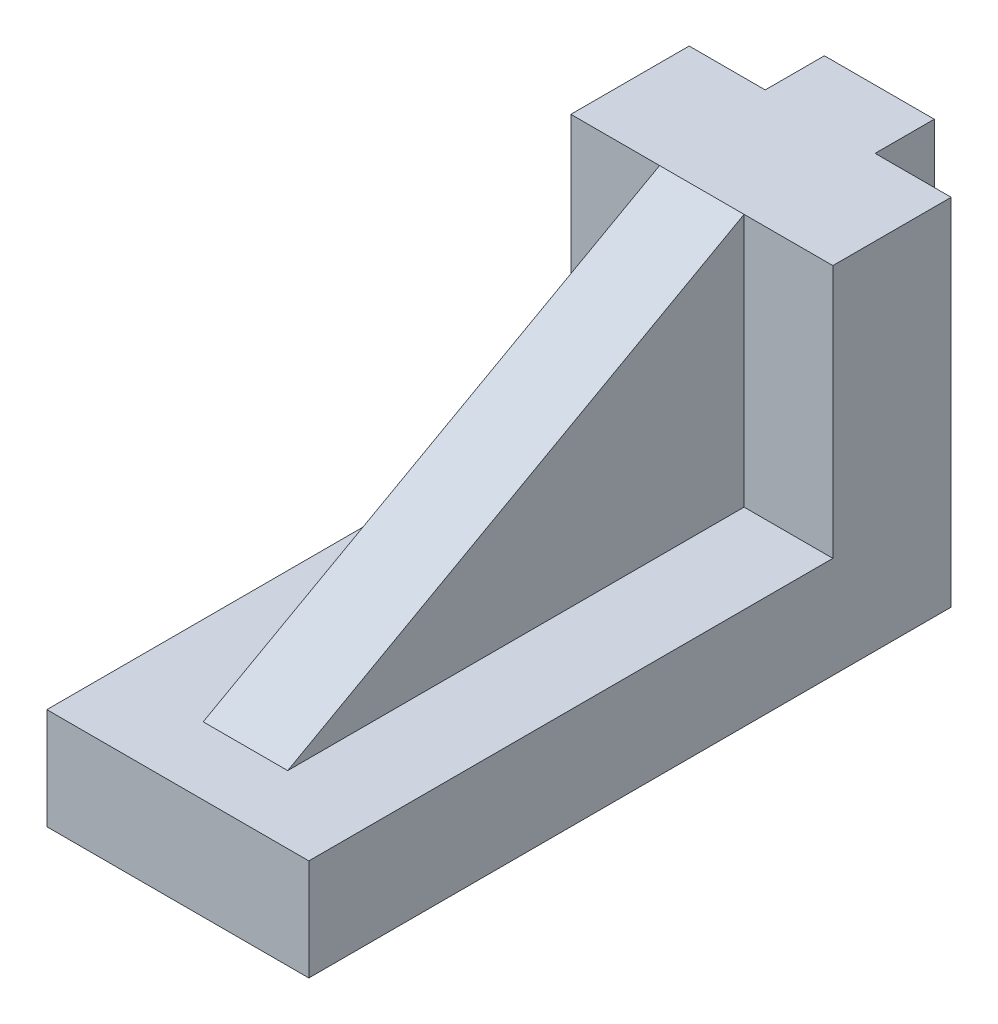
ISO-10303-21;
HEADER;
FILE_DESCRIPTION(('STEP AP214'),'2;1');
FILE_NAME('part.step','',(''),(''),'','','');
FILE_SCHEMA(('AUTOMOTIVE_DESIGN { 1 0 10303 214 1 1 1 1 }'));
ENDSEC;
DATA;
#1=APPLICATION_CONTEXT('core data for automotive mechanical design processes');
#2=APPLICATION_PROTOCOL_DEFINITION('international standard','automotive_design',2000,#1);
#3=PRODUCT_CONTEXT('',#1,'mechanical');
#4=PRODUCT('Part','Part','',(#3));
#5=PRODUCT_RELATED_PRODUCT_CATEGORY('part','',(#4));
#6=PRODUCT_DEFINITION_FORMATION('','',#4);
#7=PRODUCT_DEFINITION_CONTEXT('part definition',#1,'design');
#8=PRODUCT_DEFINITION('design','',#6,#7);
#9=PRODUCT_DEFINITION_SHAPE('','',#8);
#10=(LENGTH_UNIT() NAMED_UNIT(*) SI_UNIT(.MILLI.,.METRE.));
#11=(NAMED_UNIT(*) PLANE_ANGLE_UNIT() SI_UNIT($,.RADIAN.));
#12=(NAMED_UNIT(*) SI_UNIT($,.STERADIAN.) SOLID_ANGLE_UNIT());
#13=UNCERTAINTY_MEASURE_WITH_UNIT(LENGTH_MEASURE(1.E-05),#10,'distance_accuracy_value','');
#14=(GEOMETRIC_REPRESENTATION_CONTEXT(3) GLOBAL_UNCERTAINTY_ASSIGNED_CONTEXT((#13)) GLOBAL_UNIT_ASSIGNED_CONTEXT((#10,
#11,#12)) REPRESENTATION_CONTEXT('',''));
#15=CARTESIAN_POINT('',(0.,0.,0.));
#16=DIRECTION('',(0.,0.,1.));
#17=DIRECTION('',(1.,0.,0.));
#18=AXIS2_PLACEMENT_3D('',#15,#16,#17);
#19=CARTESIAN_POINT('',(15.5,42.,14.));
#20=DIRECTION('',(0.,0.,-1.));
#21=DIRECTION('',(0.,1.,0.));
#22=AXIS2_PLACEMENT_3D('',#19,#20,#21);
#23=PLANE('',#22);
#24=DIRECTION('',(0.,-1.,0.));
#25=VECTOR('',#24,1.);
#26=CARTESIAN_POINT('',(-5.,42.,14.));
#27=LINE('',#26,#25);
#28=CARTESIAN_POINT('',(-5.,42.,14.));
#29=VERTEX_POINT('',#28);
#30=CARTESIAN_POINT('',(-5.,12.,14.));
#31=VERTEX_POINT('',#30);
#32=EDGE_CURVE('E52',#29,#31,#27,.T.);
#33=ORIENTED_EDGE('',*,*,#32,.F.);
#34=DIRECTION('',(-1.,0.,0.));
#35=VECTOR('',#34,1.);
#36=CARTESIAN_POINT('',(15.5,42.,14.));
#37=LINE('',#36,#35);
#38=CARTESIAN_POINT('',(-15.5,42.,14.));
#39=VERTEX_POINT('',#38);
#40=EDGE_CURVE('E225',#29,#39,#37,.T.);
#41=ORIENTED_EDGE('',*,*,#40,.T.);
#42=DIRECTION('',(0.,-1.,0.));
#43=VECTOR('',#42,1.);
#44=CARTESIAN_POINT('',(-15.5,42.,14.));
#45=LINE('',#44,#43);
#46=CARTESIAN_POINT('',(-15.5,12.,14.));
#47=VERTEX_POINT('',#46);
#48=EDGE_CURVE('E206',#39,#47,#45,.T.);
#49=ORIENTED_EDGE('',*,*,#48,.T.);
#50=DIRECTION('',(-1.,0.,0.));
#51=VECTOR('',#50,1.);
#52=CARTESIAN_POINT('',(15.5,12.,14.));
#53=LINE('',#52,#51);
#54=EDGE_CURVE('E223',#31,#47,#53,.T.);
#55=ORIENTED_EDGE('',*,*,#54,.F.);
#56=EDGE_LOOP('',(#33,#41,#49,#55));
#57=FACE_BOUND('',#56,.T.);
#58=ADVANCED_FACE('F37',(#57),#23,.F.);
#59=CARTESIAN_POINT('',(15.5,42.,0.));
#60=DIRECTION('',(0.,0.,1.));
#61=DIRECTION('',(0.,-1.,0.));
#62=AXIS2_PLACEMENT_3D('',#59,#60,#61);
#63=PLANE('',#62);
#64=DIRECTION('',(0.,1.,0.));
#65=VECTOR('',#64,1.);
#66=CARTESIAN_POINT('',(-6.5,-14.7648230602334,0.));
#67=LINE('',#66,#65);
#68=CARTESIAN_POINT('',(-6.5,0.,0.));
#69=VERTEX_POINT('',#68);
#70=CARTESIAN_POINT('',(-6.5,42.,0.));
#71=VERTEX_POINT('',#70);
#72=EDGE_CURVE('E177',#69,#71,#67,.T.);
#73=ORIENTED_EDGE('',*,*,#72,.F.);
#74=DIRECTION('',(-1.,0.,0.));
#75=VECTOR('',#74,1.);
#76=CARTESIAN_POINT('',(15.5,0.,0.));
#77=LINE('',#76,#75);
#78=CARTESIAN_POINT('',(-15.5,0.,0.));
#79=VERTEX_POINT('',#78);
#80=EDGE_CURVE('E200',#69,#79,#77,.T.);
#81=ORIENTED_EDGE('',*,*,#80,.T.);
#82=DIRECTION('',(0.,1.,0.));
#83=VECTOR('',#82,1.);
#84=CARTESIAN_POINT('',(-15.5,42.,0.));
#85=LINE('',#84,#83);
#86=CARTESIAN_POINT('',(-15.5,42.,0.));
#87=VERTEX_POINT('',#86);
#88=EDGE_CURVE('E169',#79,#87,#85,.T.);
#89=ORIENTED_EDGE('',*,*,#88,.T.);
#90=DIRECTION('',(-1.,0.,0.));
#91=VECTOR('',#90,1.);
#92=CARTESIAN_POINT('',(15.5,42.,0.));
#93=LINE('',#92,#91);
#94=EDGE_CURVE('E45',#71,#87,#93,.T.);
#95=ORIENTED_EDGE('',*,*,#94,.F.);
#96=EDGE_LOOP('',(#73,#81,#89,#95));
#97=FACE_BOUND('',#96,.T.);
#98=ADVANCED_FACE('F261',(#97),#63,.F.);
#99=CARTESIAN_POINT('',(15.5,0.,0.));
#100=VERTEX_POINT('',#99);
#101=CARTESIAN_POINT('',(6.5,0.,0.));
#102=VERTEX_POINT('',#101);
#103=EDGE_CURVE('E216',#100,#102,#77,.T.);
#104=ORIENTED_EDGE('',*,*,#103,.T.);
#105=DIRECTION('',(0.,1.,0.));
#106=VECTOR('',#105,1.);
#107=CARTESIAN_POINT('',(6.5,-14.7648230602334,0.));
#108=LINE('',#107,#106);
#109=CARTESIAN_POINT('',(6.5,42.,0.));
#110=VERTEX_POINT('',#109);
#111=EDGE_CURVE('E182',#102,#110,#108,.T.);
#112=ORIENTED_EDGE('',*,*,#111,.T.);
#113=CARTESIAN_POINT('',(15.5,42.,0.));
#114=VERTEX_POINT('',#113);
#115=EDGE_CURVE('E11',#114,#110,#93,.T.);
#116=ORIENTED_EDGE('',*,*,#115,.F.);
#117=DIRECTION('',(0.,1.,0.));
#118=VECTOR('',#117,1.);
#119=CARTESIAN_POINT('',(15.5,42.,0.));
#120=LINE('',#119,#118);
#121=EDGE_CURVE('E186',#100,#114,#120,.T.);
#122=ORIENTED_EDGE('',*,*,#121,.F.);
#123=EDGE_LOOP('',(#104,#112,#116,#122));
#124=FACE_BOUND('',#123,.T.);
#125=ADVANCED_FACE('F39',(#124),#63,.F.);
#126=CARTESIAN_POINT('',(15.5,42.,14.));
#127=DIRECTION('',(0.,-1.,0.));
#128=DIRECTION('',(0.,0.,-1.));
#129=AXIS2_PLACEMENT_3D('',#126,#127,#128);
#130=PLANE('',#129);
#131=DIRECTION('',(-1.,0.,0.));
#132=VECTOR('',#131,1.);
#133=CARTESIAN_POINT('',(-6.5,42.,-7.00000000000001));
#134=LINE('',#133,#132);
#135=CARTESIAN_POINT('',(6.5,42.,-7.00000000000001));
#136=VERTEX_POINT('',#135);
#137=CARTESIAN_POINT('',(-6.5,42.,-7.00000000000001));
#138=VERTEX_POINT('',#137);
#139=EDGE_CURVE('E175',#136,#138,#134,.T.);
#140=ORIENTED_EDGE('',*,*,#139,.T.);
#141=DIRECTION('',(0.,0.,1.));
#142=VECTOR('',#141,1.);
#143=CARTESIAN_POINT('',(-6.5,42.,0.));
#144=LINE('',#143,#142);
#145=EDGE_CURVE('E160',#138,#71,#144,.T.);
#146=ORIENTED_EDGE('',*,*,#145,.T.);
#147=ORIENTED_EDGE('',*,*,#94,.T.);
#148=DIRECTION('',(0.,0.,1.));
#149=VECTOR('',#148,1.);
#150=CARTESIAN_POINT('',(-15.5,42.,14.));
#151=LINE('',#150,#149);
#152=EDGE_CURVE('E203',#87,#39,#151,.T.);
#153=ORIENTED_EDGE('',*,*,#152,.T.);
#154=ORIENTED_EDGE('',*,*,#40,.F.);
#155=DIRECTION('',(1.,0.,0.));
#156=VECTOR('',#155,1.);
#157=CARTESIAN_POINT('',(15.5,42.,14.));
#158=LINE('',#157,#156);
#159=CARTESIAN_POINT('',(5.,42.,14.));
#160=VERTEX_POINT('',#159);
#161=EDGE_CURVE('E59',#29,#160,#158,.T.);
#162=ORIENTED_EDGE('',*,*,#161,.T.);
#163=CARTESIAN_POINT('',(15.5,42.,14.));
#164=VERTEX_POINT('',#163);
#165=EDGE_CURVE('E226',#164,#160,#37,.T.);
#166=ORIENTED_EDGE('',*,*,#165,.F.);
#167=DIRECTION('',(0.,0.,1.));
#168=VECTOR('',#167,1.);
#169=CARTESIAN_POINT('',(15.5,42.,14.));
#170=LINE('',#169,#168);
#171=EDGE_CURVE('E189',#114,#164,#170,.T.);
#172=ORIENTED_EDGE('',*,*,#171,.F.);
#173=ORIENTED_EDGE('',*,*,#115,.T.);
#174=DIRECTION('',(0.,0.,-1.));
#175=VECTOR('',#174,1.);
#176=CARTESIAN_POINT('',(6.5,42.,0.));
#177=LINE('',#176,#175);
#178=EDGE_CURVE('E172',#110,#136,#177,.T.);
#179=ORIENTED_EDGE('',*,*,#178,.T.);
#180=EDGE_LOOP('',(#140,#146,#147,#153,#154,#162,#166,#172,#173,#179));
#181=FACE_BOUND('',#180,.T.);
#182=ADVANCED_FACE('F233',(#181),#130,.F.);
#183=ORIENTED_EDGE('',*,*,#165,.T.);
#184=DIRECTION('',(0.,-1.,0.));
#185=VECTOR('',#184,1.);
#186=CARTESIAN_POINT('',(5.,42.,14.));
#187=LINE('',#186,#185);
#188=CARTESIAN_POINT('',(5.,12.,14.));
#189=VERTEX_POINT('',#188);
#190=EDGE_CURVE('E149',#160,#189,#187,.T.);
#191=ORIENTED_EDGE('',*,*,#190,.T.);
#192=CARTESIAN_POINT('',(15.5,12.,14.));
#193=VERTEX_POINT('',#192);
#194=EDGE_CURVE('E224',#193,#189,#53,.T.);
#195=ORIENTED_EDGE('',*,*,#194,.F.);
#196=DIRECTION('',(0.,-1.,0.));
#197=VECTOR('',#196,1.);
#198=CARTESIAN_POINT('',(15.5,42.,14.));
#199=LINE('',#198,#197);
#200=EDGE_CURVE('E192',#164,#193,#199,.T.);
#201=ORIENTED_EDGE('',*,*,#200,.F.);
#202=EDGE_LOOP('',(#183,#191,#195,#201));
#203=FACE_BOUND('',#202,.T.);
#204=ADVANCED_FACE('F252',(#203),#23,.F.);
#205=CARTESIAN_POINT('',(15.5,12.,76.));
#206=DIRECTION('',(0.,-1.,0.));
#207=DIRECTION('',(0.,0.,-1.));
#208=AXIS2_PLACEMENT_3D('',#205,#206,#207);
#209=PLANE('',#208);
#210=ORIENTED_EDGE('',*,*,#194,.T.);
#211=DIRECTION('',(0.,0.,1.));
#212=VECTOR('',#211,1.);
#213=CARTESIAN_POINT('',(5.,12.,76.));
#214=LINE('',#213,#212);
#215=CARTESIAN_POINT('',(5.,12.,68.));
#216=VERTEX_POINT('',#215);
#217=EDGE_CURVE('E139',#189,#216,#214,.T.);
#218=ORIENTED_EDGE('',*,*,#217,.T.);
#219=DIRECTION('',(-1.,0.,0.));
#220=VECTOR('',#219,1.);
#221=CARTESIAN_POINT('',(15.5,12.,68.));
#222=LINE('',#221,#220);
#223=CARTESIAN_POINT('',(-5.,12.,68.));
#224=VERTEX_POINT('',#223);
#225=EDGE_CURVE('E133',#216,#224,#222,.T.);
#226=ORIENTED_EDGE('',*,*,#225,.T.);
#227=DIRECTION('',(0.,0.,1.));
#228=VECTOR('',#227,1.);
#229=CARTESIAN_POINT('',(-5.,12.,76.));
#230=LINE('',#229,#228);
#231=EDGE_CURVE('E137',#31,#224,#230,.T.);
#232=ORIENTED_EDGE('',*,*,#231,.F.);
#233=ORIENTED_EDGE('',*,*,#54,.T.);
#234=DIRECTION('',(0.,0.,1.));
#235=VECTOR('',#234,1.);
#236=CARTESIAN_POINT('',(-15.5,12.,76.));
#237=LINE('',#236,#235);
#238=CARTESIAN_POINT('',(-15.5,12.,76.));
#239=VERTEX_POINT('',#238);
#240=EDGE_CURVE('E209',#47,#239,#237,.T.);
#241=ORIENTED_EDGE('',*,*,#240,.T.);
#242=DIRECTION('',(-1.,0.,0.));
#243=VECTOR('',#242,1.);
#244=CARTESIAN_POINT('',(15.5,12.,76.));
#245=LINE('',#244,#243);
#246=CARTESIAN_POINT('',(15.5,12.,76.));
#247=VERTEX_POINT('',#246);
#248=EDGE_CURVE('E220',#247,#239,#245,.T.);
#249=ORIENTED_EDGE('',*,*,#248,.F.);
#250=DIRECTION('',(0.,0.,1.));
#251=VECTOR('',#250,1.);
#252=CARTESIAN_POINT('',(15.5,12.,76.));
#253=LINE('',#252,#251);
#254=EDGE_CURVE('E194',#193,#247,#253,.T.);
#255=ORIENTED_EDGE('',*,*,#254,.F.);
#256=EDGE_LOOP('',(#210,#218,#226,#232,#233,#241,#249,#255));
#257=FACE_BOUND('',#256,.T.);
#258=ADVANCED_FACE('F136',(#257),#209,.F.);
#259=CARTESIAN_POINT('',(15.5,12.,76.));
#260=DIRECTION('',(0.,0.,-1.));
#261=DIRECTION('',(-1.,0.,0.));
#262=AXIS2_PLACEMENT_3D('',#259,#260,#261);
#263=PLANE('',#262);
#264=DIRECTION('',(0.,-1.,0.));
#265=VECTOR('',#264,1.);
#266=CARTESIAN_POINT('',(-15.5,12.,76.));
#267=LINE('',#266,#265);
#268=CARTESIAN_POINT('',(-15.5,0.,76.));
#269=VERTEX_POINT('',#268);
#270=EDGE_CURVE('E211',#239,#269,#267,.T.);
#271=ORIENTED_EDGE('',*,*,#270,.T.);
#272=DIRECTION('',(-1.,0.,0.));
#273=VECTOR('',#272,1.);
#274=CARTESIAN_POINT('',(15.5,0.,76.));
#275=LINE('',#274,#273);
#276=CARTESIAN_POINT('',(15.5,0.,76.));
#277=VERTEX_POINT('',#276);
#278=EDGE_CURVE('E218',#277,#269,#275,.T.);
#279=ORIENTED_EDGE('',*,*,#278,.F.);
#280=DIRECTION('',(0.,-1.,0.));
#281=VECTOR('',#280,1.);
#282=CARTESIAN_POINT('',(15.5,12.,76.));
#283=LINE('',#282,#281);
#284=EDGE_CURVE('E196',#247,#277,#283,.T.);
#285=ORIENTED_EDGE('',*,*,#284,.F.);
#286=ORIENTED_EDGE('',*,*,#248,.T.);
#287=EDGE_LOOP('',(#271,#279,#285,#286));
#288=FACE_BOUND('',#287,.T.);
#289=ADVANCED_FACE('F243',(#288),#263,.F.);
#290=CARTESIAN_POINT('',(15.5,0.,76.));
#291=DIRECTION('',(0.,1.,0.));
#292=DIRECTION('',(0.,0.,1.));
#293=AXIS2_PLACEMENT_3D('',#290,#291,#292);
#294=PLANE('',#293);
#295=ORIENTED_EDGE('',*,*,#278,.T.);
#296=DIRECTION('',(0.,0.,-1.));
#297=VECTOR('',#296,1.);
#298=CARTESIAN_POINT('',(-15.5,0.,76.));
#299=LINE('',#298,#297);
#300=EDGE_CURVE('E190',#269,#79,#299,.T.);
#301=ORIENTED_EDGE('',*,*,#300,.T.);
#302=ORIENTED_EDGE('',*,*,#80,.F.);
#303=DIRECTION('',(0.,0.,-1.));
#304=VECTOR('',#303,1.);
#305=CARTESIAN_POINT('',(-6.5,0.,0.));
#306=LINE('',#305,#304);
#307=CARTESIAN_POINT('',(-6.5,0.,-7.00000000000001));
#308=VERTEX_POINT('',#307);
#309=EDGE_CURVE('E167',#69,#308,#306,.T.);
#310=ORIENTED_EDGE('',*,*,#309,.T.);
#311=DIRECTION('',(1.,0.,0.));
#312=VECTOR('',#311,1.);
#313=CARTESIAN_POINT('',(-6.5,0.,-7.00000000000001));
#314=LINE('',#313,#312);
#315=CARTESIAN_POINT('',(6.5,0.,-7.00000000000001));
#316=VERTEX_POINT('',#315);
#317=EDGE_CURVE('E164',#308,#316,#314,.T.);
#318=ORIENTED_EDGE('',*,*,#317,.T.);
#319=DIRECTION('',(0.,0.,1.));
#320=VECTOR('',#319,1.);
#321=CARTESIAN_POINT('',(6.5,0.,0.));
#322=LINE('',#321,#320);
#323=EDGE_CURVE('E161',#316,#102,#322,.T.);
#324=ORIENTED_EDGE('',*,*,#323,.T.);
#325=ORIENTED_EDGE('',*,*,#103,.F.);
#326=DIRECTION('',(0.,0.,-1.));
#327=VECTOR('',#326,1.);
#328=CARTESIAN_POINT('',(15.5,0.,76.));
#329=LINE('',#328,#327);
#330=EDGE_CURVE('E198',#277,#100,#329,.T.);
#331=ORIENTED_EDGE('',*,*,#330,.F.);
#332=EDGE_LOOP('',(#295,#301,#302,#310,#318,#324,#325,#331));
#333=FACE_BOUND('',#332,.T.);
#334=ADVANCED_FACE('F275',(#333),#294,.F.);
#335=CARTESIAN_POINT('',(15.5,0.,0.));
#336=DIRECTION('',(1.,0.,0.));
#337=DIRECTION('',(0.,0.,-1.));
#338=AXIS2_PLACEMENT_3D('',#335,#336,#337);
#339=PLANE('',#338);
#340=ORIENTED_EDGE('',*,*,#121,.T.);
#341=ORIENTED_EDGE('',*,*,#171,.T.);
#342=ORIENTED_EDGE('',*,*,#200,.T.);
#343=ORIENTED_EDGE('',*,*,#254,.T.);
#344=ORIENTED_EDGE('',*,*,#284,.T.);
#345=ORIENTED_EDGE('',*,*,#330,.T.);
#346=EDGE_LOOP('',(#340,#341,#342,#343,#344,#345));
#347=FACE_BOUND('',#346,.T.);
#348=ADVANCED_FACE('F247',(#347),#339,.T.);
#349=CARTESIAN_POINT('',(-15.5,0.,0.));
#350=DIRECTION('',(1.,0.,0.));
#351=DIRECTION('',(0.,0.,-1.));
#352=AXIS2_PLACEMENT_3D('',#349,#350,#351);
#353=PLANE('',#352);
#354=ORIENTED_EDGE('',*,*,#88,.F.);
#355=ORIENTED_EDGE('',*,*,#300,.F.);
#356=ORIENTED_EDGE('',*,*,#270,.F.);
#357=ORIENTED_EDGE('',*,*,#240,.F.);
#358=ORIENTED_EDGE('',*,*,#48,.F.);
#359=ORIENTED_EDGE('',*,*,#152,.F.);
#360=EDGE_LOOP('',(#354,#355,#356,#357,#358,#359));
#361=FACE_BOUND('',#360,.T.);
#362=ADVANCED_FACE('F236',(#361),#353,.F.);
#363=CARTESIAN_POINT('',(-6.5,-14.7648230602334,0.));
#364=DIRECTION('',(-1.,0.,0.));
#365=DIRECTION('',(0.,0.,1.));
#366=AXIS2_PLACEMENT_3D('',#363,#364,#365);
#367=PLANE('',#366);
#368=ORIENTED_EDGE('',*,*,#309,.F.);
#369=ORIENTED_EDGE('',*,*,#72,.T.);
#370=ORIENTED_EDGE('',*,*,#145,.F.);
#371=DIRECTION('',(0.,1.,0.));
#372=VECTOR('',#371,1.);
#373=CARTESIAN_POINT('',(-6.5,-14.7648230602334,-7.00000000000001));
#374=LINE('',#373,#372);
#375=EDGE_CURVE('E165',#308,#138,#374,.T.);
#376=ORIENTED_EDGE('',*,*,#375,.F.);
#377=EDGE_LOOP('',(#368,#369,#370,#376));
#378=FACE_BOUND('',#377,.T.);
#379=ADVANCED_FACE('F278',(#378),#367,.T.);
#380=CARTESIAN_POINT('',(-6.5,-14.7648230602334,-7.00000000000001));
#381=DIRECTION('',(0.,0.,-1.));
#382=DIRECTION('',(-1.,0.,0.));
#383=AXIS2_PLACEMENT_3D('',#380,#381,#382);
#384=PLANE('',#383);
#385=DIRECTION('',(0.,1.,0.));
#386=VECTOR('',#385,1.);
#387=CARTESIAN_POINT('',(6.5,-14.7648230602334,-7.00000000000001));
#388=LINE('',#387,#386);
#389=EDGE_CURVE('E180',#316,#136,#388,.T.);
#390=ORIENTED_EDGE('',*,*,#389,.F.);
#391=ORIENTED_EDGE('',*,*,#317,.F.);
#392=ORIENTED_EDGE('',*,*,#375,.T.);
#393=ORIENTED_EDGE('',*,*,#139,.F.);
#394=EDGE_LOOP('',(#390,#391,#392,#393));
#395=FACE_BOUND('',#394,.T.);
#396=ADVANCED_FACE('F282',(#395),#384,.T.);
#397=CARTESIAN_POINT('',(6.5,-14.7648230602334,0.));
#398=DIRECTION('',(1.,0.,0.));
#399=DIRECTION('',(0.,0.,-1.));
#400=AXIS2_PLACEMENT_3D('',#397,#398,#399);
#401=PLANE('',#400);
#402=ORIENTED_EDGE('',*,*,#323,.F.);
#403=ORIENTED_EDGE('',*,*,#389,.T.);
#404=ORIENTED_EDGE('',*,*,#178,.F.);
#405=ORIENTED_EDGE('',*,*,#111,.F.);
#406=EDGE_LOOP('',(#402,#403,#404,#405));
#407=FACE_BOUND('',#406,.T.);
#408=ADVANCED_FACE('F286',(#407),#401,.T.);
#409=CARTESIAN_POINT('',(0.,42.,14.));
#410=DIRECTION('',(0.,0.874157276121538,0.485642931178632));
#411=DIRECTION('',(0.,-0.485642931178632,0.874157276121538));
#412=AXIS2_PLACEMENT_3D('',#409,#410,#411);
#413=PLANE('',#412);
#414=ORIENTED_EDGE('',*,*,#161,.F.);
#415=DIRECTION('',(0.,-0.485642931178632,0.874157276121538));
#416=VECTOR('',#415,1.);
#417=CARTESIAN_POINT('',(-5.,42.,14.));
#418=LINE('',#417,#416);
#419=EDGE_CURVE('E148',#29,#224,#418,.T.);
#420=ORIENTED_EDGE('',*,*,#419,.T.);
#421=ORIENTED_EDGE('',*,*,#225,.F.);
#422=DIRECTION('',(0.,-0.485642931178632,0.874157276121538));
#423=VECTOR('',#422,1.);
#424=CARTESIAN_POINT('',(5.,42.,14.));
#425=LINE('',#424,#423);
#426=EDGE_CURVE('E152',#160,#216,#425,.T.);
#427=ORIENTED_EDGE('',*,*,#426,.F.);
#428=EDGE_LOOP('',(#414,#420,#421,#427));
#429=FACE_BOUND('',#428,.T.);
#430=ADVANCED_FACE('F151',(#429),#413,.T.);
#431=CARTESIAN_POINT('',(5.,21.,34.5));
#432=DIRECTION('',(1.,0.,0.));
#433=DIRECTION('',(0.,0.,-1.));
#434=AXIS2_PLACEMENT_3D('',#431,#432,#433);
#435=PLANE('',#434);
#436=ORIENTED_EDGE('',*,*,#217,.F.);
#437=ORIENTED_EDGE('',*,*,#190,.F.);
#438=ORIENTED_EDGE('',*,*,#426,.T.);
#439=EDGE_LOOP('',(#436,#437,#438));
#440=FACE_BOUND('',#439,.T.);
#441=ADVANCED_FACE('F251',(#440),#435,.T.);
#442=CARTESIAN_POINT('',(-5.,21.,34.5));
#443=DIRECTION('',(1.,0.,0.));
#444=DIRECTION('',(0.,0.,-1.));
#445=AXIS2_PLACEMENT_3D('',#442,#443,#444);
#446=PLANE('',#445);
#447=ORIENTED_EDGE('',*,*,#32,.T.);
#448=ORIENTED_EDGE('',*,*,#231,.T.);
#449=ORIENTED_EDGE('',*,*,#419,.F.);
#450=EDGE_LOOP('',(#447,#448,#449));
#451=FACE_BOUND('',#450,.T.);
#452=ADVANCED_FACE('F147',(#451),#446,.F.);
#453=CLOSED_SHELL('',(#58,#98,#125,#182,#204,#258,#289,#334,#348,#362,#379,#396,#408,#430,#441,#452));
#454=MANIFOLD_SOLID_BREP('B2',#453);
#455=ADVANCED_BREP_SHAPE_REPRESENTATION('',(#18,#454),#14);
#456=SHAPE_DEFINITION_REPRESENTATION(#9,#455);
ENDSEC;
END-ISO-10303-21;
